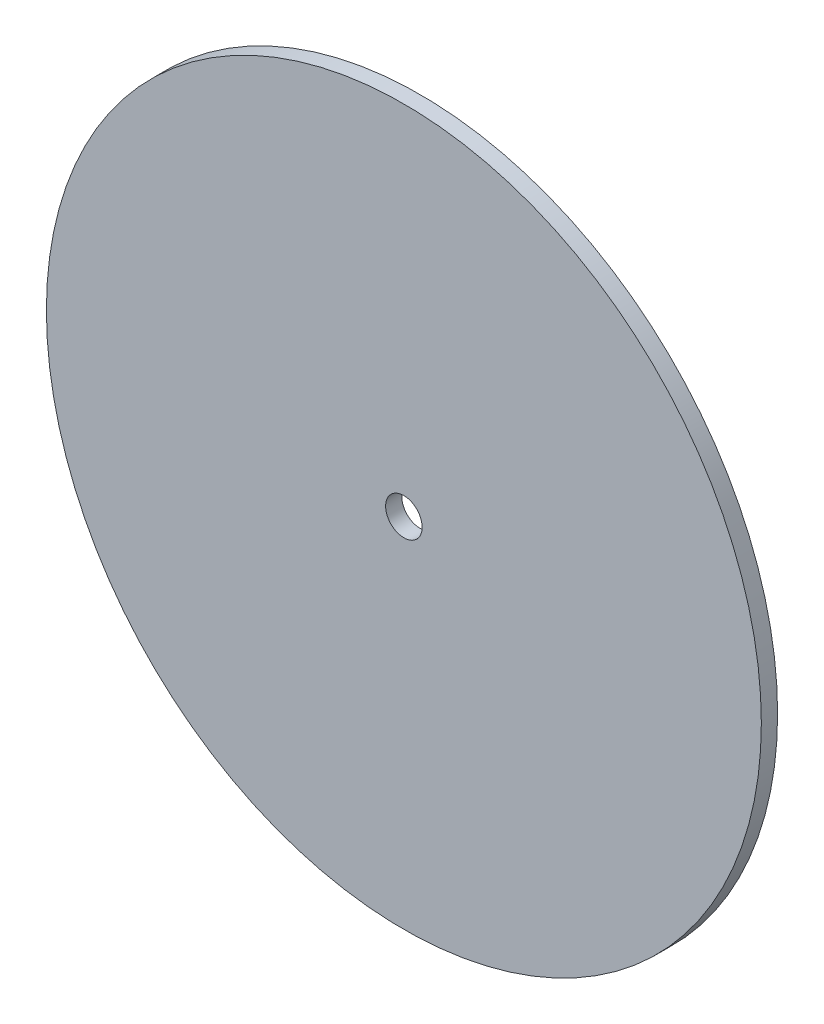
ISO-10303-21;
HEADER;
FILE_DESCRIPTION(('STEP AP214'),'2;1');
FILE_NAME('part.step','',(''),(''),'','','');
FILE_SCHEMA(('AUTOMOTIVE_DESIGN { 1 0 10303 214 1 1 1 1 }'));
ENDSEC;
DATA;
#1=APPLICATION_CONTEXT('core data for automotive mechanical design processes');
#2=APPLICATION_PROTOCOL_DEFINITION('international standard','automotive_design',2000,#1);
#3=PRODUCT_CONTEXT('',#1,'mechanical');
#4=PRODUCT('Part','Part','',(#3));
#5=PRODUCT_RELATED_PRODUCT_CATEGORY('part','',(#4));
#6=PRODUCT_DEFINITION_FORMATION('','',#4);
#7=PRODUCT_DEFINITION_CONTEXT('part definition',#1,'design');
#8=PRODUCT_DEFINITION('design','',#6,#7);
#9=PRODUCT_DEFINITION_SHAPE('','',#8);
#10=(LENGTH_UNIT() NAMED_UNIT(*) SI_UNIT(.MILLI.,.METRE.));
#11=(NAMED_UNIT(*) PLANE_ANGLE_UNIT() SI_UNIT($,.RADIAN.));
#12=(NAMED_UNIT(*) SI_UNIT($,.STERADIAN.) SOLID_ANGLE_UNIT());
#13=UNCERTAINTY_MEASURE_WITH_UNIT(LENGTH_MEASURE(1.E-05),#10,'distance_accuracy_value','');
#14=(GEOMETRIC_REPRESENTATION_CONTEXT(3) GLOBAL_UNCERTAINTY_ASSIGNED_CONTEXT((#13)) GLOBAL_UNIT_ASSIGNED_CONTEXT((#10,
#11,#12)) REPRESENTATION_CONTEXT('',''));
#15=CARTESIAN_POINT('',(0.,0.,0.));
#16=DIRECTION('',(0.,0.,1.));
#17=DIRECTION('',(1.,0.,0.));
#18=AXIS2_PLACEMENT_3D('',#15,#16,#17);
#19=CARTESIAN_POINT('',(0.,0.,12.7));
#20=DIRECTION('',(0.,0.,1.));
#21=DIRECTION('',(1.,0.,0.));
#22=AXIS2_PLACEMENT_3D('',#19,#20,#21);
#23=PLANE('',#22);
#24=CARTESIAN_POINT('',(0.,0.,12.7));
#25=DIRECTION('',(0.,0.,1.));
#26=DIRECTION('',(1.,0.,0.));
#27=AXIS2_PLACEMENT_3D('',#24,#25,#26);
#28=CIRCLE('',#27,279.4);
#29=CARTESIAN_POINT('',(279.4,0.,12.7));
#30=VERTEX_POINT('',#29);
#31=EDGE_CURVE('E10',#30,#30,#28,.T.);
#32=ORIENTED_EDGE('',*,*,#31,.T.);
#33=EDGE_LOOP('',(#32));
#34=FACE_BOUND('',#33,.T.);
#35=CARTESIAN_POINT('',(0.,0.,12.7));
#36=DIRECTION('',(0.,0.,1.));
#37=DIRECTION('',(1.,0.,0.));
#38=AXIS2_PLACEMENT_3D('',#35,#36,#37);
#39=CIRCLE('',#38,14.2875);
#40=CARTESIAN_POINT('',(14.2875,0.,12.7));
#41=VERTEX_POINT('',#40);
#42=EDGE_CURVE('E49',#41,#41,#39,.T.);
#43=ORIENTED_EDGE('',*,*,#42,.F.);
#44=EDGE_LOOP('',(#43));
#45=FACE_BOUND('',#44,.T.);
#46=ADVANCED_FACE('F39',(#34,#45),#23,.T.);
#47=CARTESIAN_POINT('',(0.,0.,0.));
#48=DIRECTION('',(0.,0.,1.));
#49=DIRECTION('',(1.,0.,0.));
#50=AXIS2_PLACEMENT_3D('',#47,#48,#49);
#51=PLANE('',#50);
#52=CARTESIAN_POINT('',(0.,0.,0.));
#53=DIRECTION('',(0.,0.,1.));
#54=DIRECTION('',(1.,0.,0.));
#55=AXIS2_PLACEMENT_3D('',#52,#53,#54);
#56=CIRCLE('',#55,279.4);
#57=CARTESIAN_POINT('',(279.4,0.,0.));
#58=VERTEX_POINT('',#57);
#59=EDGE_CURVE('E43',#58,#58,#56,.T.);
#60=ORIENTED_EDGE('',*,*,#59,.F.);
#61=EDGE_LOOP('',(#60));
#62=FACE_BOUND('',#61,.T.);
#63=CARTESIAN_POINT('',(0.,0.,0.));
#64=DIRECTION('',(0.,0.,1.));
#65=DIRECTION('',(1.,0.,0.));
#66=AXIS2_PLACEMENT_3D('',#63,#64,#65);
#67=CIRCLE('',#66,14.2875);
#68=CARTESIAN_POINT('',(14.2875,0.,0.));
#69=VERTEX_POINT('',#68);
#70=EDGE_CURVE('E55',#69,#69,#67,.T.);
#71=ORIENTED_EDGE('',*,*,#70,.T.);
#72=EDGE_LOOP('',(#71));
#73=FACE_BOUND('',#72,.T.);
#74=ADVANCED_FACE('F65',(#62,#73),#51,.F.);
#75=CARTESIAN_POINT('',(0.,0.,12.7));
#76=DIRECTION('',(0.,0.,-1.));
#77=DIRECTION('',(-1.,0.,0.));
#78=AXIS2_PLACEMENT_3D('',#75,#76,#77);
#79=CYLINDRICAL_SURFACE('',#78,279.4);
#80=ORIENTED_EDGE('',*,*,#31,.F.);
#81=EDGE_LOOP('',(#80));
#82=FACE_BOUND('',#81,.T.);
#83=ORIENTED_EDGE('',*,*,#59,.T.);
#84=EDGE_LOOP('',(#83));
#85=FACE_BOUND('',#84,.T.);
#86=ADVANCED_FACE('F41',(#82,#85),#79,.T.);
#87=CARTESIAN_POINT('',(0.,0.,12.7));
#88=DIRECTION('',(0.,0.,-1.));
#89=DIRECTION('',(-1.,0.,0.));
#90=AXIS2_PLACEMENT_3D('',#87,#88,#89);
#91=CYLINDRICAL_SURFACE('',#90,14.2875);
#92=ORIENTED_EDGE('',*,*,#42,.T.);
#93=EDGE_LOOP('',(#92));
#94=FACE_BOUND('',#93,.T.);
#95=ORIENTED_EDGE('',*,*,#70,.F.);
#96=EDGE_LOOP('',(#95));
#97=FACE_BOUND('',#96,.T.);
#98=ADVANCED_FACE('F59',(#94,#97),#91,.F.);
#99=CLOSED_SHELL('',(#46,#74,#86,#98));
#100=MANIFOLD_SOLID_BREP('B2',#99);
#101=ADVANCED_BREP_SHAPE_REPRESENTATION('',(#18,#100),#14);
#102=SHAPE_DEFINITION_REPRESENTATION(#9,#101);
ENDSEC;
END-ISO-10303-21;
